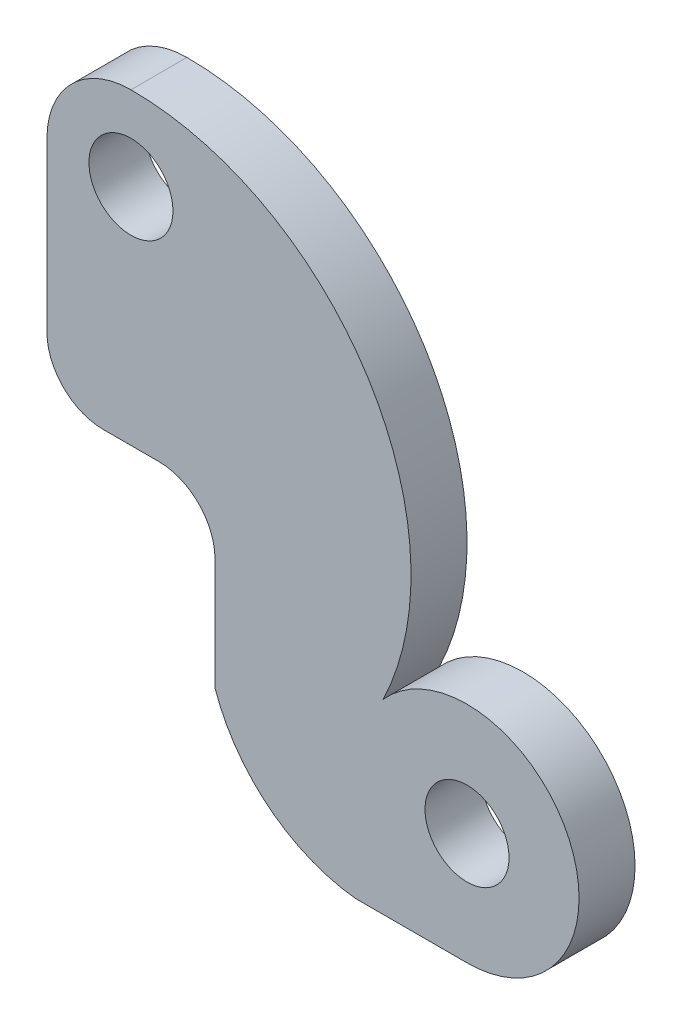
ISO-10303-21;
HEADER;
FILE_DESCRIPTION(('STEP AP214'),'2;1');
FILE_NAME('part.step','',(''),(''),'','','');
FILE_SCHEMA(('AUTOMOTIVE_DESIGN { 1 0 10303 214 1 1 1 1 }'));
ENDSEC;
DATA;
#1=APPLICATION_CONTEXT('core data for automotive mechanical design processes');
#2=APPLICATION_PROTOCOL_DEFINITION('international standard','automotive_design',2000,#1);
#3=PRODUCT_CONTEXT('',#1,'mechanical');
#4=PRODUCT('Part','Part','',(#3));
#5=PRODUCT_RELATED_PRODUCT_CATEGORY('part','',(#4));
#6=PRODUCT_DEFINITION_FORMATION('','',#4);
#7=PRODUCT_DEFINITION_CONTEXT('part definition',#1,'design');
#8=PRODUCT_DEFINITION('design','',#6,#7);
#9=PRODUCT_DEFINITION_SHAPE('','',#8);
#10=(LENGTH_UNIT() NAMED_UNIT(*) SI_UNIT(.MILLI.,.METRE.));
#11=(NAMED_UNIT(*) PLANE_ANGLE_UNIT() SI_UNIT($,.RADIAN.));
#12=(NAMED_UNIT(*) SI_UNIT($,.STERADIAN.) SOLID_ANGLE_UNIT());
#13=UNCERTAINTY_MEASURE_WITH_UNIT(LENGTH_MEASURE(1.E-05),#10,'distance_accuracy_value','');
#14=(GEOMETRIC_REPRESENTATION_CONTEXT(3) GLOBAL_UNCERTAINTY_ASSIGNED_CONTEXT((#13)) GLOBAL_UNIT_ASSIGNED_CONTEXT((#10,
#11,#12)) REPRESENTATION_CONTEXT('',''));
#15=CARTESIAN_POINT('',(0.,0.,0.));
#16=DIRECTION('',(0.,0.,1.));
#17=DIRECTION('',(1.,0.,0.));
#18=AXIS2_PLACEMENT_3D('',#15,#16,#17);
#19=CARTESIAN_POINT('',(0.,0.,5.));
#20=DIRECTION('',(0.,0.,-1.));
#21=DIRECTION('',(-1.,0.,0.));
#22=AXIS2_PLACEMENT_3D('',#19,#20,#21);
#23=PLANE('',#22);
#24=CARTESIAN_POINT('',(0.,0.,5.));
#25=DIRECTION('',(0.,0.,1.));
#26=DIRECTION('',(-1.,0.,0.));
#27=AXIS2_PLACEMENT_3D('',#24,#25,#26);
#28=CIRCLE('',#27,15.);
#29=CARTESIAN_POINT('',(0.,15.,5.));
#30=VERTEX_POINT('',#29);
#31=CARTESIAN_POINT('',(-15.,0.,5.));
#32=VERTEX_POINT('',#31);
#33=EDGE_CURVE('E186',#30,#32,#28,.T.);
#34=ORIENTED_EDGE('',*,*,#33,.T.);
#35=DIRECTION('',(0.,-1.,0.));
#36=VECTOR('',#35,1.);
#37=CARTESIAN_POINT('',(-15.,0.,5.));
#38=LINE('',#37,#36);
#39=CARTESIAN_POINT('',(-15.,-30.,5.));
#40=VERTEX_POINT('',#39);
#41=EDGE_CURVE('E110',#32,#40,#38,.T.);
#42=ORIENTED_EDGE('',*,*,#41,.T.);
#43=CARTESIAN_POINT('',(-5.,-30.,5.));
#44=DIRECTION('',(0.,0.,1.));
#45=DIRECTION('',(1.,0.,0.));
#46=AXIS2_PLACEMENT_3D('',#43,#44,#45);
#47=CIRCLE('',#46,10.);
#48=CARTESIAN_POINT('',(-5.,-40.,5.));
#49=VERTEX_POINT('',#48);
#50=EDGE_CURVE('E215',#40,#49,#47,.T.);
#51=ORIENTED_EDGE('',*,*,#50,.T.);
#52=DIRECTION('',(1.,0.,0.));
#53=VECTOR('',#52,1.);
#54=CARTESIAN_POINT('',(-5.,-40.,5.));
#55=LINE('',#54,#53);
#56=CARTESIAN_POINT('',(5.00000000000001,-40.,5.));
#57=VERTEX_POINT('',#56);
#58=EDGE_CURVE('E235',#49,#57,#55,.T.);
#59=ORIENTED_EDGE('',*,*,#58,.T.);
#60=CARTESIAN_POINT('',(5.00000000000001,-50.,5.));
#61=DIRECTION('',(0.,0.,-1.));
#62=DIRECTION('',(-1.,0.,0.));
#63=AXIS2_PLACEMENT_3D('',#60,#61,#62);
#64=CIRCLE('',#63,10.);
#65=CARTESIAN_POINT('',(15.,-50.,5.));
#66=VERTEX_POINT('',#65);
#67=EDGE_CURVE('E231',#57,#66,#64,.T.);
#68=ORIENTED_EDGE('',*,*,#67,.T.);
#69=DIRECTION('',(0.,-1.,0.));
#70=VECTOR('',#69,1.);
#71=CARTESIAN_POINT('',(15.,-50.,5.));
#72=LINE('',#71,#70);
#73=CARTESIAN_POINT('',(15.,-70.,5.));
#74=VERTEX_POINT('',#73);
#75=EDGE_CURVE('E234',#66,#74,#72,.T.);
#76=ORIENTED_EDGE('',*,*,#75,.T.);
#77=CARTESIAN_POINT('',(43.3499057471999,-60.1876178160001,5.));
#78=DIRECTION('',(0.,0.,1.));
#79=DIRECTION('',(1.,0.,0.));
#80=AXIS2_PLACEMENT_3D('',#77,#78,#79);
#81=CIRCLE('',#80,30.);
#82=CARTESIAN_POINT('',(40.,-90.,5.));
#83=VERTEX_POINT('',#82);
#84=EDGE_CURVE('E135',#74,#83,#81,.T.);
#85=ORIENTED_EDGE('',*,*,#84,.T.);
#86=DIRECTION('',(1.,0.,0.));
#87=VECTOR('',#86,1.);
#88=CARTESIAN_POINT('',(60.,-90.,5.));
#89=LINE('',#88,#87);
#90=CARTESIAN_POINT('',(60.,-90.,5.));
#91=VERTEX_POINT('',#90);
#92=EDGE_CURVE('E129',#83,#91,#89,.T.);
#93=ORIENTED_EDGE('',*,*,#92,.T.);
#94=CARTESIAN_POINT('',(60.,-70.,5.));
#95=DIRECTION('',(0.,0.,1.));
#96=DIRECTION('',(1.,0.,0.));
#97=AXIS2_PLACEMENT_3D('',#94,#95,#96);
#98=CIRCLE('',#97,20.);
#99=CARTESIAN_POINT('',(45.024841203361,-56.7431293656668,5.));
#100=VERTEX_POINT('',#99);
#101=EDGE_CURVE('E133',#91,#100,#98,.T.);
#102=ORIENTED_EDGE('',*,*,#101,.T.);
#103=CARTESIAN_POINT('',(0.,-35.,5.));
#104=DIRECTION('',(0.,0.,1.));
#105=DIRECTION('',(-1.,0.,0.));
#106=AXIS2_PLACEMENT_3D('',#103,#104,#105);
#107=CIRCLE('',#106,50.);
#108=EDGE_CURVE('E61',#100,#30,#107,.T.);
#109=ORIENTED_EDGE('',*,*,#108,.T.);
#110=EDGE_LOOP('',(#34,#42,#51,#59,#68,#76,#85,#93,#102,#109));
#111=FACE_BOUND('',#110,.T.);
#112=CARTESIAN_POINT('',(0.,0.,5.));
#113=DIRECTION('',(0.,0.,1.));
#114=DIRECTION('',(1.,0.,0.));
#115=AXIS2_PLACEMENT_3D('',#112,#113,#114);
#116=CIRCLE('',#115,7.50000000000001);
#117=CARTESIAN_POINT('',(7.50000000000001,0.,5.));
#118=VERTEX_POINT('',#117);
#119=EDGE_CURVE('E162',#118,#118,#116,.T.);
#120=ORIENTED_EDGE('',*,*,#119,.F.);
#121=EDGE_LOOP('',(#120));
#122=FACE_BOUND('',#121,.T.);
#123=CARTESIAN_POINT('',(60.,-70.,5.));
#124=DIRECTION('',(0.,0.,1.));
#125=DIRECTION('',(1.,0.,0.));
#126=AXIS2_PLACEMENT_3D('',#123,#124,#125);
#127=CIRCLE('',#126,7.50000000000001);
#128=CARTESIAN_POINT('',(67.5,-70.,5.));
#129=VERTEX_POINT('',#128);
#130=EDGE_CURVE('E253',#129,#129,#127,.T.);
#131=ORIENTED_EDGE('',*,*,#130,.F.);
#132=EDGE_LOOP('',(#131));
#133=FACE_BOUND('',#132,.T.);
#134=ADVANCED_FACE('F43',(#111,#122,#133),#23,.F.);
#135=CARTESIAN_POINT('',(0.,0.,-5.));
#136=DIRECTION('',(0.,0.,-1.));
#137=DIRECTION('',(-1.,0.,0.));
#138=AXIS2_PLACEMENT_3D('',#135,#136,#137);
#139=PLANE('',#138);
#140=CARTESIAN_POINT('',(0.,0.,-5.));
#141=DIRECTION('',(0.,0.,1.));
#142=DIRECTION('',(1.,0.,0.));
#143=AXIS2_PLACEMENT_3D('',#140,#141,#142);
#144=CIRCLE('',#143,7.50000000000001);
#145=CARTESIAN_POINT('',(7.50000000000001,0.,-5.));
#146=VERTEX_POINT('',#145);
#147=EDGE_CURVE('E249',#146,#146,#144,.T.);
#148=ORIENTED_EDGE('',*,*,#147,.T.);
#149=EDGE_LOOP('',(#148));
#150=FACE_BOUND('',#149,.T.);
#151=CARTESIAN_POINT('',(0.,0.,-5.));
#152=DIRECTION('',(0.,0.,1.));
#153=DIRECTION('',(-1.,0.,0.));
#154=AXIS2_PLACEMENT_3D('',#151,#152,#153);
#155=CIRCLE('',#154,15.);
#156=CARTESIAN_POINT('',(0.,15.,-5.));
#157=VERTEX_POINT('',#156);
#158=CARTESIAN_POINT('',(-15.,0.,-5.));
#159=VERTEX_POINT('',#158);
#160=EDGE_CURVE('E157',#157,#159,#155,.T.);
#161=ORIENTED_EDGE('',*,*,#160,.F.);
#162=CARTESIAN_POINT('',(0.,-35.,-5.));
#163=DIRECTION('',(0.,0.,1.));
#164=DIRECTION('',(-1.,0.,0.));
#165=AXIS2_PLACEMENT_3D('',#162,#163,#164);
#166=CIRCLE('',#165,50.);
#167=CARTESIAN_POINT('',(45.024841203361,-56.7431293656668,-5.));
#168=VERTEX_POINT('',#167);
#169=EDGE_CURVE('E102',#168,#157,#166,.T.);
#170=ORIENTED_EDGE('',*,*,#169,.F.);
#171=CARTESIAN_POINT('',(60.,-70.,-5.));
#172=DIRECTION('',(0.,0.,1.));
#173=DIRECTION('',(1.,0.,0.));
#174=AXIS2_PLACEMENT_3D('',#171,#172,#173);
#175=CIRCLE('',#174,20.);
#176=CARTESIAN_POINT('',(60.,-90.,-5.));
#177=VERTEX_POINT('',#176);
#178=EDGE_CURVE('E96',#177,#168,#175,.T.);
#179=ORIENTED_EDGE('',*,*,#178,.F.);
#180=DIRECTION('',(1.,0.,0.));
#181=VECTOR('',#180,1.);
#182=CARTESIAN_POINT('',(60.,-90.,-5.));
#183=LINE('',#182,#181);
#184=CARTESIAN_POINT('',(40.,-90.,-5.));
#185=VERTEX_POINT('',#184);
#186=EDGE_CURVE('E144',#185,#177,#183,.T.);
#187=ORIENTED_EDGE('',*,*,#186,.F.);
#188=CARTESIAN_POINT('',(43.3499057471999,-60.1876178160001,-5.));
#189=DIRECTION('',(0.,0.,1.));
#190=DIRECTION('',(1.,0.,0.));
#191=AXIS2_PLACEMENT_3D('',#188,#189,#190);
#192=CIRCLE('',#191,30.);
#193=CARTESIAN_POINT('',(15.,-70.,-5.));
#194=VERTEX_POINT('',#193);
#195=EDGE_CURVE('E177',#194,#185,#192,.T.);
#196=ORIENTED_EDGE('',*,*,#195,.F.);
#197=DIRECTION('',(0.,-1.,0.));
#198=VECTOR('',#197,1.);
#199=CARTESIAN_POINT('',(15.,-50.,-5.));
#200=LINE('',#199,#198);
#201=CARTESIAN_POINT('',(15.,-50.,-5.));
#202=VERTEX_POINT('',#201);
#203=EDGE_CURVE('E174',#202,#194,#200,.T.);
#204=ORIENTED_EDGE('',*,*,#203,.F.);
#205=CARTESIAN_POINT('',(5.00000000000001,-50.,-5.));
#206=DIRECTION('',(0.,0.,-1.));
#207=DIRECTION('',(-1.,0.,0.));
#208=AXIS2_PLACEMENT_3D('',#205,#206,#207);
#209=CIRCLE('',#208,10.);
#210=CARTESIAN_POINT('',(5.00000000000001,-40.,-5.));
#211=VERTEX_POINT('',#210);
#212=EDGE_CURVE('E171',#211,#202,#209,.T.);
#213=ORIENTED_EDGE('',*,*,#212,.F.);
#214=DIRECTION('',(1.,0.,0.));
#215=VECTOR('',#214,1.);
#216=CARTESIAN_POINT('',(-5.,-40.,-5.));
#217=LINE('',#216,#215);
#218=CARTESIAN_POINT('',(-5.,-40.,-5.));
#219=VERTEX_POINT('',#218);
#220=EDGE_CURVE('E168',#219,#211,#217,.T.);
#221=ORIENTED_EDGE('',*,*,#220,.F.);
#222=CARTESIAN_POINT('',(-5.,-30.,-5.));
#223=DIRECTION('',(0.,0.,1.));
#224=DIRECTION('',(1.,0.,0.));
#225=AXIS2_PLACEMENT_3D('',#222,#223,#224);
#226=CIRCLE('',#225,10.);
#227=CARTESIAN_POINT('',(-15.,-30.,-5.));
#228=VERTEX_POINT('',#227);
#229=EDGE_CURVE('E165',#228,#219,#226,.T.);
#230=ORIENTED_EDGE('',*,*,#229,.F.);
#231=DIRECTION('',(0.,-1.,0.));
#232=VECTOR('',#231,1.);
#233=CARTESIAN_POINT('',(-15.,0.,-5.));
#234=LINE('',#233,#232);
#235=EDGE_CURVE('E161',#159,#228,#234,.T.);
#236=ORIENTED_EDGE('',*,*,#235,.F.);
#237=EDGE_LOOP('',(#161,#170,#179,#187,#196,#204,#213,#221,#230,#236));
#238=FACE_BOUND('',#237,.T.);
#239=CARTESIAN_POINT('',(60.,-70.,-5.));
#240=DIRECTION('',(0.,0.,1.));
#241=DIRECTION('',(1.,0.,0.));
#242=AXIS2_PLACEMENT_3D('',#239,#240,#241);
#243=CIRCLE('',#242,7.50000000000001);
#244=CARTESIAN_POINT('',(67.5,-70.,-5.));
#245=VERTEX_POINT('',#244);
#246=EDGE_CURVE('E257',#245,#245,#243,.T.);
#247=ORIENTED_EDGE('',*,*,#246,.T.);
#248=EDGE_LOOP('',(#247));
#249=FACE_BOUND('',#248,.T.);
#250=ADVANCED_FACE('F219',(#150,#238,#249),#139,.T.);
#251=CARTESIAN_POINT('',(0.,0.,5.));
#252=DIRECTION('',(0.,0.,-1.));
#253=DIRECTION('',(-1.,0.,0.));
#254=AXIS2_PLACEMENT_3D('',#251,#252,#253);
#255=CYLINDRICAL_SURFACE('',#254,15.);
#256=ORIENTED_EDGE('',*,*,#160,.T.);
#257=DIRECTION('',(0.,0.,-1.));
#258=VECTOR('',#257,1.);
#259=CARTESIAN_POINT('',(-15.,0.,5.));
#260=LINE('',#259,#258);
#261=EDGE_CURVE('E11',#32,#159,#260,.T.);
#262=ORIENTED_EDGE('',*,*,#261,.F.);
#263=ORIENTED_EDGE('',*,*,#33,.F.);
#264=DIRECTION('',(0.,0.,-1.));
#265=VECTOR('',#264,1.);
#266=CARTESIAN_POINT('',(0.,15.,5.));
#267=LINE('',#266,#265);
#268=EDGE_CURVE('E153',#30,#157,#267,.T.);
#269=ORIENTED_EDGE('',*,*,#268,.T.);
#270=EDGE_LOOP('',(#256,#262,#263,#269));
#271=FACE_BOUND('',#270,.T.);
#272=ADVANCED_FACE('F45',(#271),#255,.T.);
#273=CARTESIAN_POINT('',(-15.,0.,5.));
#274=DIRECTION('',(1.,0.,0.));
#275=DIRECTION('',(0.,1.,0.));
#276=AXIS2_PLACEMENT_3D('',#273,#274,#275);
#277=PLANE('',#276);
#278=ORIENTED_EDGE('',*,*,#235,.T.);
#279=DIRECTION('',(0.,0.,-1.));
#280=VECTOR('',#279,1.);
#281=CARTESIAN_POINT('',(-15.,-30.,5.));
#282=LINE('',#281,#280);
#283=EDGE_CURVE('E53',#40,#228,#282,.T.);
#284=ORIENTED_EDGE('',*,*,#283,.F.);
#285=ORIENTED_EDGE('',*,*,#41,.F.);
#286=ORIENTED_EDGE('',*,*,#261,.T.);
#287=EDGE_LOOP('',(#278,#284,#285,#286));
#288=FACE_BOUND('',#287,.T.);
#289=ADVANCED_FACE('F299',(#288),#277,.F.);
#290=CARTESIAN_POINT('',(-5.,-30.,5.));
#291=DIRECTION('',(0.,0.,-1.));
#292=DIRECTION('',(-1.,0.,0.));
#293=AXIS2_PLACEMENT_3D('',#290,#291,#292);
#294=CYLINDRICAL_SURFACE('',#293,10.);
#295=ORIENTED_EDGE('',*,*,#229,.T.);
#296=DIRECTION('',(0.,0.,-1.));
#297=VECTOR('',#296,1.);
#298=CARTESIAN_POINT('',(-5.,-40.,5.));
#299=LINE('',#298,#297);
#300=EDGE_CURVE('E205',#49,#219,#299,.T.);
#301=ORIENTED_EDGE('',*,*,#300,.F.);
#302=ORIENTED_EDGE('',*,*,#50,.F.);
#303=ORIENTED_EDGE('',*,*,#283,.T.);
#304=EDGE_LOOP('',(#295,#301,#302,#303));
#305=FACE_BOUND('',#304,.T.);
#306=ADVANCED_FACE('F213',(#305),#294,.T.);
#307=CARTESIAN_POINT('',(-5.,-40.,5.));
#308=DIRECTION('',(0.,1.,0.));
#309=DIRECTION('',(0.,0.,1.));
#310=AXIS2_PLACEMENT_3D('',#307,#308,#309);
#311=PLANE('',#310);
#312=ORIENTED_EDGE('',*,*,#220,.T.);
#313=DIRECTION('',(0.,0.,-1.));
#314=VECTOR('',#313,1.);
#315=CARTESIAN_POINT('',(5.00000000000001,-40.,5.));
#316=LINE('',#315,#314);
#317=EDGE_CURVE('E201',#57,#211,#316,.T.);
#318=ORIENTED_EDGE('',*,*,#317,.F.);
#319=ORIENTED_EDGE('',*,*,#58,.F.);
#320=ORIENTED_EDGE('',*,*,#300,.T.);
#321=EDGE_LOOP('',(#312,#318,#319,#320));
#322=FACE_BOUND('',#321,.T.);
#323=ADVANCED_FACE('F225',(#322),#311,.F.);
#324=CARTESIAN_POINT('',(5.00000000000001,-50.,5.));
#325=DIRECTION('',(0.,0.,-1.));
#326=DIRECTION('',(-1.,0.,0.));
#327=AXIS2_PLACEMENT_3D('',#324,#325,#326);
#328=CYLINDRICAL_SURFACE('',#327,10.);
#329=ORIENTED_EDGE('',*,*,#212,.T.);
#330=DIRECTION('',(0.,0.,-1.));
#331=VECTOR('',#330,1.);
#332=CARTESIAN_POINT('',(15.,-50.,5.));
#333=LINE('',#332,#331);
#334=EDGE_CURVE('E197',#66,#202,#333,.T.);
#335=ORIENTED_EDGE('',*,*,#334,.F.);
#336=ORIENTED_EDGE('',*,*,#67,.F.);
#337=ORIENTED_EDGE('',*,*,#317,.T.);
#338=EDGE_LOOP('',(#329,#335,#336,#337));
#339=FACE_BOUND('',#338,.T.);
#340=ADVANCED_FACE('F229',(#339),#328,.F.);
#341=CARTESIAN_POINT('',(15.,-50.,5.));
#342=DIRECTION('',(1.,0.,0.));
#343=DIRECTION('',(0.,1.,0.));
#344=AXIS2_PLACEMENT_3D('',#341,#342,#343);
#345=PLANE('',#344);
#346=ORIENTED_EDGE('',*,*,#203,.T.);
#347=DIRECTION('',(0.,0.,-1.));
#348=VECTOR('',#347,1.);
#349=CARTESIAN_POINT('',(15.,-70.,5.));
#350=LINE('',#349,#348);
#351=EDGE_CURVE('E193',#74,#194,#350,.T.);
#352=ORIENTED_EDGE('',*,*,#351,.F.);
#353=ORIENTED_EDGE('',*,*,#75,.F.);
#354=ORIENTED_EDGE('',*,*,#334,.T.);
#355=EDGE_LOOP('',(#346,#352,#353,#354));
#356=FACE_BOUND('',#355,.T.);
#357=ADVANCED_FACE('F289',(#356),#345,.F.);
#358=CARTESIAN_POINT('',(43.3499057471999,-60.1876178160001,5.));
#359=DIRECTION('',(0.,0.,-1.));
#360=DIRECTION('',(-1.,0.,0.));
#361=AXIS2_PLACEMENT_3D('',#358,#359,#360);
#362=CYLINDRICAL_SURFACE('',#361,30.);
#363=ORIENTED_EDGE('',*,*,#195,.T.);
#364=DIRECTION('',(0.,0.,-1.));
#365=VECTOR('',#364,1.);
#366=CARTESIAN_POINT('',(40.,-90.,5.));
#367=LINE('',#366,#365);
#368=EDGE_CURVE('E146',#83,#185,#367,.T.);
#369=ORIENTED_EDGE('',*,*,#368,.F.);
#370=ORIENTED_EDGE('',*,*,#84,.F.);
#371=ORIENTED_EDGE('',*,*,#351,.T.);
#372=EDGE_LOOP('',(#363,#369,#370,#371));
#373=FACE_BOUND('',#372,.T.);
#374=ADVANCED_FACE('F286',(#373),#362,.T.);
#375=CARTESIAN_POINT('',(60.,-90.,5.));
#376=DIRECTION('',(0.,1.,0.));
#377=DIRECTION('',(-1.,0.,0.));
#378=AXIS2_PLACEMENT_3D('',#375,#376,#377);
#379=PLANE('',#378);
#380=ORIENTED_EDGE('',*,*,#186,.T.);
#381=DIRECTION('',(0.,0.,-1.));
#382=VECTOR('',#381,1.);
#383=CARTESIAN_POINT('',(60.,-90.,5.));
#384=LINE('',#383,#382);
#385=EDGE_CURVE('E141',#91,#177,#384,.T.);
#386=ORIENTED_EDGE('',*,*,#385,.F.);
#387=ORIENTED_EDGE('',*,*,#92,.F.);
#388=ORIENTED_EDGE('',*,*,#368,.T.);
#389=EDGE_LOOP('',(#380,#386,#387,#388));
#390=FACE_BOUND('',#389,.T.);
#391=ADVANCED_FACE('F142',(#390),#379,.F.);
#392=CARTESIAN_POINT('',(60.,-70.,5.));
#393=DIRECTION('',(0.,0.,-1.));
#394=DIRECTION('',(-1.,0.,0.));
#395=AXIS2_PLACEMENT_3D('',#392,#393,#394);
#396=CYLINDRICAL_SURFACE('',#395,20.);
#397=ORIENTED_EDGE('',*,*,#178,.T.);
#398=DIRECTION('',(0.,0.,-1.));
#399=VECTOR('',#398,1.);
#400=CARTESIAN_POINT('',(45.024841203361,-56.7431293656668,5.));
#401=LINE('',#400,#399);
#402=EDGE_CURVE('E147',#100,#168,#401,.T.);
#403=ORIENTED_EDGE('',*,*,#402,.F.);
#404=ORIENTED_EDGE('',*,*,#101,.F.);
#405=ORIENTED_EDGE('',*,*,#385,.T.);
#406=EDGE_LOOP('',(#397,#403,#404,#405));
#407=FACE_BOUND('',#406,.T.);
#408=ADVANCED_FACE('F149',(#407),#396,.T.);
#409=CARTESIAN_POINT('',(0.,-35.,5.));
#410=DIRECTION('',(0.,0.,-1.));
#411=DIRECTION('',(-1.,0.,0.));
#412=AXIS2_PLACEMENT_3D('',#409,#410,#411);
#413=CYLINDRICAL_SURFACE('',#412,50.);
#414=ORIENTED_EDGE('',*,*,#169,.T.);
#415=ORIENTED_EDGE('',*,*,#268,.F.);
#416=ORIENTED_EDGE('',*,*,#108,.F.);
#417=ORIENTED_EDGE('',*,*,#402,.T.);
#418=EDGE_LOOP('',(#414,#415,#416,#417));
#419=FACE_BOUND('',#418,.T.);
#420=ADVANCED_FACE('F279',(#419),#413,.T.);
#421=CARTESIAN_POINT('',(0.,0.,5.));
#422=DIRECTION('',(0.,0.,-1.));
#423=DIRECTION('',(-1.,0.,0.));
#424=AXIS2_PLACEMENT_3D('',#421,#422,#423);
#425=CYLINDRICAL_SURFACE('',#424,7.50000000000001);
#426=ORIENTED_EDGE('',*,*,#119,.T.);
#427=EDGE_LOOP('',(#426));
#428=FACE_BOUND('',#427,.T.);
#429=ORIENTED_EDGE('',*,*,#147,.F.);
#430=EDGE_LOOP('',(#429));
#431=FACE_BOUND('',#430,.T.);
#432=ADVANCED_FACE('F276',(#428,#431),#425,.F.);
#433=CARTESIAN_POINT('',(60.,-70.,5.));
#434=DIRECTION('',(0.,0.,-1.));
#435=DIRECTION('',(-1.,0.,0.));
#436=AXIS2_PLACEMENT_3D('',#433,#434,#435);
#437=CYLINDRICAL_SURFACE('',#436,7.50000000000001);
#438=ORIENTED_EDGE('',*,*,#130,.T.);
#439=EDGE_LOOP('',(#438));
#440=FACE_BOUND('',#439,.T.);
#441=ORIENTED_EDGE('',*,*,#246,.F.);
#442=EDGE_LOOP('',(#441));
#443=FACE_BOUND('',#442,.T.);
#444=ADVANCED_FACE('F265',(#440,#443),#437,.F.);
#445=CLOSED_SHELL('',(#134,#250,#272,#289,#306,#323,#340,#357,#374,#391,#408,#420,#432,#444));
#446=MANIFOLD_SOLID_BREP('B2',#445);
#447=ADVANCED_BREP_SHAPE_REPRESENTATION('',(#18,#446),#14);
#448=SHAPE_DEFINITION_REPRESENTATION(#9,#447);
ENDSEC;
END-ISO-10303-21;
